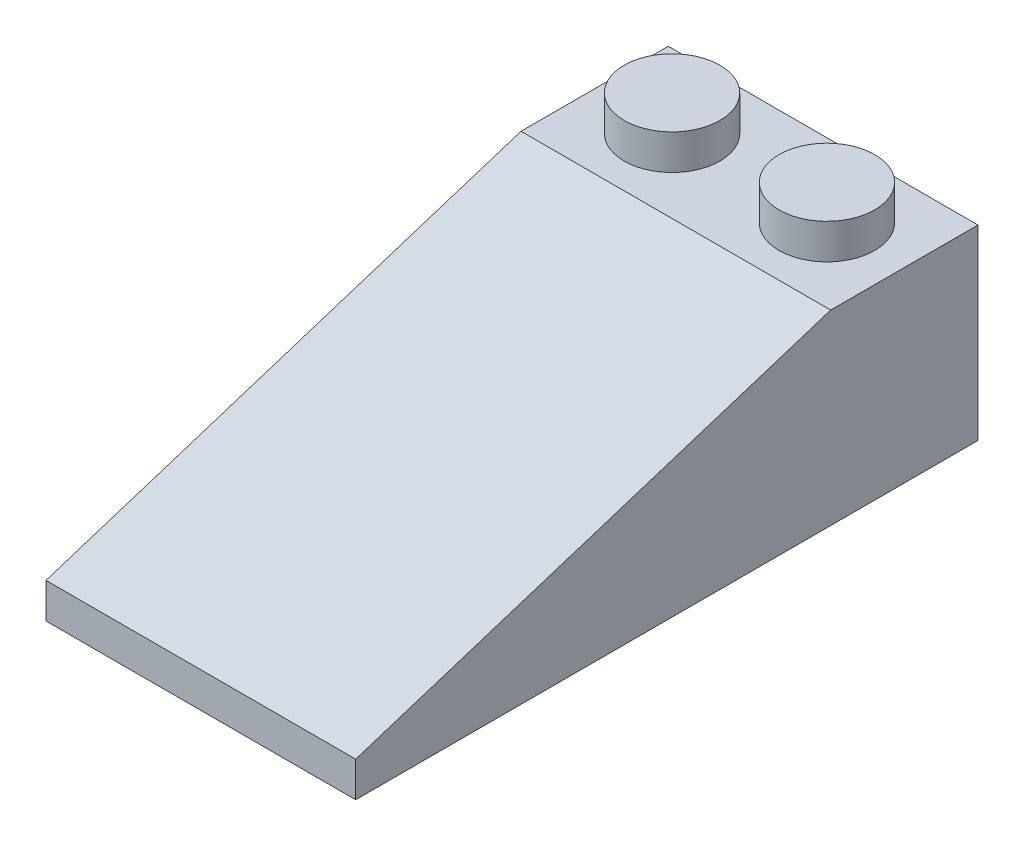
ISO-10303-21;
HEADER;
FILE_DESCRIPTION(('STEP AP214'),'2;1');
FILE_NAME('part.step','',(''),(''),'','','');
FILE_SCHEMA(('AUTOMOTIVE_DESIGN { 1 0 10303 214 1 1 1 1 }'));
ENDSEC;
DATA;
#1=APPLICATION_CONTEXT('core data for automotive mechanical design processes');
#2=APPLICATION_PROTOCOL_DEFINITION('international standard','automotive_design',2000,#1);
#3=PRODUCT_CONTEXT('',#1,'mechanical');
#4=PRODUCT('Part','Part','',(#3));
#5=PRODUCT_RELATED_PRODUCT_CATEGORY('part','',(#4));
#6=PRODUCT_DEFINITION_FORMATION('','',#4);
#7=PRODUCT_DEFINITION_CONTEXT('part definition',#1,'design');
#8=PRODUCT_DEFINITION('design','',#6,#7);
#9=PRODUCT_DEFINITION_SHAPE('','',#8);
#10=(LENGTH_UNIT() NAMED_UNIT(*) SI_UNIT(.MILLI.,.METRE.));
#11=(NAMED_UNIT(*) PLANE_ANGLE_UNIT() SI_UNIT($,.RADIAN.));
#12=(NAMED_UNIT(*) SI_UNIT($,.STERADIAN.) SOLID_ANGLE_UNIT());
#13=UNCERTAINTY_MEASURE_WITH_UNIT(LENGTH_MEASURE(1.E-05),#10,'distance_accuracy_value','');
#14=(GEOMETRIC_REPRESENTATION_CONTEXT(3) GLOBAL_UNCERTAINTY_ASSIGNED_CONTEXT((#13)) GLOBAL_UNIT_ASSIGNED_CONTEXT((#10,
#11,#12)) REPRESENTATION_CONTEXT('',''));
#15=CARTESIAN_POINT('',(0.,0.,0.));
#16=DIRECTION('',(0.,0.,1.));
#17=DIRECTION('',(1.,0.,0.));
#18=AXIS2_PLACEMENT_3D('',#15,#16,#17);
#19=CARTESIAN_POINT('',(-15.85,8.05,7.54));
#20=DIRECTION('',(0.,1.,0.));
#21=DIRECTION('',(0.,0.,1.));
#22=AXIS2_PLACEMENT_3D('',#19,#20,#21);
#23=PLANE('',#22);
#24=CARTESIAN_POINT('',(-3.9625,8.05,3.77));
#25=DIRECTION('',(0.,1.,0.));
#26=DIRECTION('',(0.,0.,1.));
#27=AXIS2_PLACEMENT_3D('',#24,#25,#26);
#28=CIRCLE('',#27,0.950000000000001);
#29=CARTESIAN_POINT('',(-3.9625,8.05,4.72));
#30=VERTEX_POINT('',#29);
#31=EDGE_CURVE('E161',#30,#30,#28,.T.);
#32=ORIENTED_EDGE('',*,*,#31,.T.);
#33=EDGE_LOOP('',(#32));
#34=FACE_BOUND('',#33,.T.);
#35=CARTESIAN_POINT('',(-11.8875,8.05,3.77));
#36=DIRECTION('',(0.,1.,0.));
#37=DIRECTION('',(0.,0.,1.));
#38=AXIS2_PLACEMENT_3D('',#35,#36,#37);
#39=CIRCLE('',#38,0.950000000000001);
#40=CARTESIAN_POINT('',(-11.8875,8.05,4.72));
#41=VERTEX_POINT('',#40);
#42=EDGE_CURVE('E157',#41,#41,#39,.T.);
#43=ORIENTED_EDGE('',*,*,#42,.T.);
#44=EDGE_LOOP('',(#43));
#45=FACE_BOUND('',#44,.T.);
#46=CARTESIAN_POINT('',(-7.92500000000005,8.05,7.9625));
#47=DIRECTION('',(0.,1.,0.));
#48=DIRECTION('',(0.,0.,1.));
#49=AXIS2_PLACEMENT_3D('',#46,#47,#48);
#50=CIRCLE('',#49,3.25);
#51=CARTESIAN_POINT('',(-11.1081442615568,8.05,7.30668553681826));
#52=VERTEX_POINT('',#51);
#53=CARTESIAN_POINT('',(-4.74185573844331,8.05,7.30668553681826));
#54=VERTEX_POINT('',#53);
#55=EDGE_CURVE('E11',#52,#54,#50,.F.);
#56=ORIENTED_EDGE('',*,*,#55,.F.);
#57=DIRECTION('',(1.,0.,0.));
#58=VECTOR('',#57,1.);
#59=CARTESIAN_POINT('',(-15.85,8.05,7.30668553681826));
#60=LINE('',#59,#58);
#61=CARTESIAN_POINT('',(-14.35,8.05,7.30668553681826));
#62=VERTEX_POINT('',#61);
#63=EDGE_CURVE('E128',#62,#52,#60,.T.);
#64=ORIENTED_EDGE('',*,*,#63,.F.);
#65=DIRECTION('',(0.,0.,1.));
#66=VECTOR('',#65,1.);
#67=CARTESIAN_POINT('',(-14.35,8.05,7.54));
#68=LINE('',#67,#66);
#69=CARTESIAN_POINT('',(-14.35,8.05,1.5));
#70=VERTEX_POINT('',#69);
#71=EDGE_CURVE('E135',#70,#62,#68,.T.);
#72=ORIENTED_EDGE('',*,*,#71,.F.);
#73=DIRECTION('',(1.,0.,0.));
#74=VECTOR('',#73,1.);
#75=CARTESIAN_POINT('',(-15.85,8.05,1.5));
#76=LINE('',#75,#74);
#77=CARTESIAN_POINT('',(-1.5,8.05,1.5));
#78=VERTEX_POINT('',#77);
#79=EDGE_CURVE('E132',#70,#78,#76,.T.);
#80=ORIENTED_EDGE('',*,*,#79,.T.);
#81=DIRECTION('',(0.,0.,1.));
#82=VECTOR('',#81,1.);
#83=CARTESIAN_POINT('',(-1.5,8.05,7.54));
#84=LINE('',#83,#82);
#85=CARTESIAN_POINT('',(-1.5,8.05,7.30668553681826));
#86=VERTEX_POINT('',#85);
#87=EDGE_CURVE('E141',#78,#86,#84,.T.);
#88=ORIENTED_EDGE('',*,*,#87,.T.);
#89=EDGE_CURVE('E129',#54,#86,#60,.T.);
#90=ORIENTED_EDGE('',*,*,#89,.F.);
#91=EDGE_LOOP('',(#56,#64,#72,#80,#88,#90));
#92=FACE_BOUND('',#91,.T.);
#93=ADVANCED_FACE('F33',(#34,#45,#92),#23,.F.);
#94=CARTESIAN_POINT('',(-15.85,0.,0.));
#95=DIRECTION('',(0.,-1.,0.));
#96=DIRECTION('',(0.,0.,-1.));
#97=AXIS2_PLACEMENT_3D('',#94,#95,#96);
#98=PLANE('',#97);
#99=DIRECTION('',(0.,0.,-1.));
#100=VECTOR('',#99,1.);
#101=CARTESIAN_POINT('',(0.,0.,0.));
#102=LINE('',#101,#100);
#103=CARTESIAN_POINT('',(0.,0.,31.85));
#104=VERTEX_POINT('',#103);
#105=CARTESIAN_POINT('',(0.,0.,0.));
#106=VERTEX_POINT('',#105);
#107=EDGE_CURVE('E187',#104,#106,#102,.T.);
#108=ORIENTED_EDGE('',*,*,#107,.F.);
#109=DIRECTION('',(1.,0.,0.));
#110=VECTOR('',#109,1.);
#111=CARTESIAN_POINT('',(-15.85,0.,31.85));
#112=LINE('',#111,#110);
#113=CARTESIAN_POINT('',(-15.85,0.,31.85));
#114=VERTEX_POINT('',#113);
#115=EDGE_CURVE('E216',#114,#104,#112,.T.);
#116=ORIENTED_EDGE('',*,*,#115,.F.);
#117=DIRECTION('',(0.,0.,-1.));
#118=VECTOR('',#117,1.);
#119=CARTESIAN_POINT('',(-15.85,0.,0.));
#120=LINE('',#119,#118);
#121=CARTESIAN_POINT('',(-15.85,0.,0.));
#122=VERTEX_POINT('',#121);
#123=EDGE_CURVE('E196',#114,#122,#120,.T.);
#124=ORIENTED_EDGE('',*,*,#123,.T.);
#125=DIRECTION('',(1.,0.,0.));
#126=VECTOR('',#125,1.);
#127=CARTESIAN_POINT('',(-15.85,0.,0.));
#128=LINE('',#127,#126);
#129=EDGE_CURVE('E213',#122,#106,#128,.T.);
#130=ORIENTED_EDGE('',*,*,#129,.T.);
#131=EDGE_LOOP('',(#108,#116,#124,#130));
#132=FACE_BOUND('',#131,.T.);
#133=DIRECTION('',(1.,0.,0.));
#134=VECTOR('',#133,1.);
#135=CARTESIAN_POINT('',(-15.85,0.,30.35));
#136=LINE('',#135,#134);
#137=CARTESIAN_POINT('',(-14.35,0.,30.35));
#138=VERTEX_POINT('',#137);
#139=CARTESIAN_POINT('',(-1.5,0.,30.35));
#140=VERTEX_POINT('',#139);
#141=EDGE_CURVE('E147',#138,#140,#136,.T.);
#142=ORIENTED_EDGE('',*,*,#141,.T.);
#143=DIRECTION('',(0.,0.,-1.));
#144=VECTOR('',#143,1.);
#145=CARTESIAN_POINT('',(-1.5,0.,0.));
#146=LINE('',#145,#144);
#147=CARTESIAN_POINT('',(-1.5,0.,1.5));
#148=VERTEX_POINT('',#147);
#149=EDGE_CURVE('E149',#140,#148,#146,.T.);
#150=ORIENTED_EDGE('',*,*,#149,.T.);
#151=DIRECTION('',(1.,0.,0.));
#152=VECTOR('',#151,1.);
#153=CARTESIAN_POINT('',(-15.85,0.,1.5));
#154=LINE('',#153,#152);
#155=CARTESIAN_POINT('',(-14.35,0.,1.5));
#156=VERTEX_POINT('',#155);
#157=EDGE_CURVE('E162',#156,#148,#154,.T.);
#158=ORIENTED_EDGE('',*,*,#157,.F.);
#159=DIRECTION('',(0.,0.,-1.));
#160=VECTOR('',#159,1.);
#161=CARTESIAN_POINT('',(-14.35,0.,0.));
#162=LINE('',#161,#160);
#163=EDGE_CURVE('E152',#138,#156,#162,.T.);
#164=ORIENTED_EDGE('',*,*,#163,.F.);
#165=EDGE_LOOP('',(#142,#150,#158,#164));
#166=FACE_BOUND('',#165,.T.);
#167=ADVANCED_FACE('F259',(#132,#166),#98,.T.);
#168=CARTESIAN_POINT('',(-15.85,9.55,0.));
#169=DIRECTION('',(0.,0.,-1.));
#170=DIRECTION('',(-1.,0.,0.));
#171=AXIS2_PLACEMENT_3D('',#168,#169,#170);
#172=PLANE('',#171);
#173=DIRECTION('',(0.,1.,0.));
#174=VECTOR('',#173,1.);
#175=CARTESIAN_POINT('',(0.,9.55,0.));
#176=LINE('',#175,#174);
#177=CARTESIAN_POINT('',(0.,9.55,0.));
#178=VERTEX_POINT('',#177);
#179=EDGE_CURVE('E180',#106,#178,#176,.T.);
#180=ORIENTED_EDGE('',*,*,#179,.F.);
#181=ORIENTED_EDGE('',*,*,#129,.F.);
#182=DIRECTION('',(0.,1.,0.));
#183=VECTOR('',#182,1.);
#184=CARTESIAN_POINT('',(-15.85,9.55,0.));
#185=LINE('',#184,#183);
#186=CARTESIAN_POINT('',(-15.85,9.55,0.));
#187=VERTEX_POINT('',#186);
#188=EDGE_CURVE('E183',#122,#187,#185,.T.);
#189=ORIENTED_EDGE('',*,*,#188,.T.);
#190=DIRECTION('',(1.,0.,0.));
#191=VECTOR('',#190,1.);
#192=CARTESIAN_POINT('',(-15.85,9.55,0.));
#193=LINE('',#192,#191);
#194=EDGE_CURVE('E199',#187,#178,#193,.T.);
#195=ORIENTED_EDGE('',*,*,#194,.T.);
#196=EDGE_LOOP('',(#180,#181,#189,#195));
#197=FACE_BOUND('',#196,.T.);
#198=ADVANCED_FACE('F35',(#197),#172,.T.);
#199=CARTESIAN_POINT('',(-15.85,0.,31.85));
#200=DIRECTION('',(0.,0.,1.));
#201=DIRECTION('',(1.,0.,0.));
#202=AXIS2_PLACEMENT_3D('',#199,#200,#201);
#203=PLANE('',#202);
#204=DIRECTION('',(0.,-1.,0.));
#205=VECTOR('',#204,1.);
#206=CARTESIAN_POINT('',(0.,0.,31.85));
#207=LINE('',#206,#205);
#208=CARTESIAN_POINT('',(0.,1.8,31.85));
#209=VERTEX_POINT('',#208);
#210=EDGE_CURVE('E208',#209,#104,#207,.T.);
#211=ORIENTED_EDGE('',*,*,#210,.F.);
#212=DIRECTION('',(1.,0.,0.));
#213=VECTOR('',#212,1.);
#214=CARTESIAN_POINT('',(-15.85,1.8,31.85));
#215=LINE('',#214,#213);
#216=CARTESIAN_POINT('',(-15.85,1.8,31.85));
#217=VERTEX_POINT('',#216);
#218=EDGE_CURVE('E218',#217,#209,#215,.T.);
#219=ORIENTED_EDGE('',*,*,#218,.F.);
#220=DIRECTION('',(0.,-1.,0.));
#221=VECTOR('',#220,1.);
#222=CARTESIAN_POINT('',(-15.85,0.,31.85));
#223=LINE('',#222,#221);
#224=EDGE_CURVE('E193',#217,#114,#223,.T.);
#225=ORIENTED_EDGE('',*,*,#224,.T.);
#226=ORIENTED_EDGE('',*,*,#115,.T.);
#227=EDGE_LOOP('',(#211,#219,#225,#226));
#228=FACE_BOUND('',#227,.T.);
#229=ADVANCED_FACE('F406',(#228),#203,.T.);
#230=CARTESIAN_POINT('',(-15.85,1.8,31.85));
#231=DIRECTION('',(0.,0.952755774285987,0.303737443468383));
#232=DIRECTION('',(0.,-0.303737443468384,0.952755774285987));
#233=AXIS2_PLACEMENT_3D('',#230,#231,#232);
#234=PLANE('',#233);
#235=DIRECTION('',(0.,-0.303737443468383,0.952755774285987));
#236=VECTOR('',#235,1.);
#237=CARTESIAN_POINT('',(0.,1.8,31.85));
#238=LINE('',#237,#236);
#239=CARTESIAN_POINT('',(0.,9.55,7.54));
#240=VERTEX_POINT('',#239);
#241=EDGE_CURVE('E205',#240,#209,#238,.T.);
#242=ORIENTED_EDGE('',*,*,#241,.F.);
#243=DIRECTION('',(1.,0.,0.));
#244=VECTOR('',#243,1.);
#245=CARTESIAN_POINT('',(-15.85,9.55,7.54));
#246=LINE('',#245,#244);
#247=CARTESIAN_POINT('',(-15.85,9.55,7.54));
#248=VERTEX_POINT('',#247);
#249=EDGE_CURVE('E220',#248,#240,#246,.T.);
#250=ORIENTED_EDGE('',*,*,#249,.F.);
#251=DIRECTION('',(0.,-0.303737443468383,0.952755774285987));
#252=VECTOR('',#251,1.);
#253=CARTESIAN_POINT('',(-15.85,1.8,31.85));
#254=LINE('',#253,#252);
#255=EDGE_CURVE('E190',#248,#217,#254,.T.);
#256=ORIENTED_EDGE('',*,*,#255,.T.);
#257=ORIENTED_EDGE('',*,*,#218,.T.);
#258=EDGE_LOOP('',(#242,#250,#256,#257));
#259=FACE_BOUND('',#258,.T.);
#260=ADVANCED_FACE('F409',(#259),#234,.T.);
#261=CARTESIAN_POINT('',(-15.85,9.55,7.54));
#262=DIRECTION('',(0.,1.,0.));
#263=DIRECTION('',(0.,0.,1.));
#264=AXIS2_PLACEMENT_3D('',#261,#262,#263);
#265=PLANE('',#264);
#266=CARTESIAN_POINT('',(-3.9625,9.55,3.77));
#267=DIRECTION('',(0.,1.,0.));
#268=DIRECTION('',(0.,0.,1.));
#269=AXIS2_PLACEMENT_3D('',#266,#267,#268);
#270=CIRCLE('',#269,2.45);
#271=CARTESIAN_POINT('',(-3.9625,9.55,6.22));
#272=VERTEX_POINT('',#271);
#273=EDGE_CURVE('E164',#272,#272,#270,.T.);
#274=ORIENTED_EDGE('',*,*,#273,.F.);
#275=EDGE_LOOP('',(#274));
#276=FACE_BOUND('',#275,.T.);
#277=CARTESIAN_POINT('',(-11.8875,9.55,3.77));
#278=DIRECTION('',(0.,1.,0.));
#279=DIRECTION('',(0.,0.,1.));
#280=AXIS2_PLACEMENT_3D('',#277,#278,#279);
#281=CIRCLE('',#280,2.45);
#282=CARTESIAN_POINT('',(-11.8875,9.55,6.22));
#283=VERTEX_POINT('',#282);
#284=EDGE_CURVE('E174',#283,#283,#281,.T.);
#285=ORIENTED_EDGE('',*,*,#284,.F.);
#286=EDGE_LOOP('',(#285));
#287=FACE_BOUND('',#286,.T.);
#288=DIRECTION('',(0.,0.,1.));
#289=VECTOR('',#288,1.);
#290=CARTESIAN_POINT('',(0.,9.55,7.54));
#291=LINE('',#290,#289);
#292=EDGE_CURVE('E202',#178,#240,#291,.T.);
#293=ORIENTED_EDGE('',*,*,#292,.F.);
#294=ORIENTED_EDGE('',*,*,#194,.F.);
#295=DIRECTION('',(0.,0.,1.));
#296=VECTOR('',#295,1.);
#297=CARTESIAN_POINT('',(-15.85,9.55,7.54));
#298=LINE('',#297,#296);
#299=EDGE_CURVE('E186',#187,#248,#298,.T.);
#300=ORIENTED_EDGE('',*,*,#299,.T.);
#301=ORIENTED_EDGE('',*,*,#249,.T.);
#302=EDGE_LOOP('',(#293,#294,#300,#301));
#303=FACE_BOUND('',#302,.T.);
#304=ADVANCED_FACE('F401',(#276,#287,#303),#265,.T.);
#305=CARTESIAN_POINT('',(-15.85,0.,0.));
#306=DIRECTION('',(-1.,0.,0.));
#307=DIRECTION('',(0.,0.,1.));
#308=AXIS2_PLACEMENT_3D('',#305,#306,#307);
#309=PLANE('',#308);
#310=ORIENTED_EDGE('',*,*,#188,.F.);
#311=ORIENTED_EDGE('',*,*,#123,.F.);
#312=ORIENTED_EDGE('',*,*,#224,.F.);
#313=ORIENTED_EDGE('',*,*,#255,.F.);
#314=ORIENTED_EDGE('',*,*,#299,.F.);
#315=EDGE_LOOP('',(#310,#311,#312,#313,#314));
#316=FACE_BOUND('',#315,.T.);
#317=ADVANCED_FACE('F398',(#316),#309,.T.);
#318=CARTESIAN_POINT('',(0.,0.,0.));
#319=DIRECTION('',(-1.,0.,0.));
#320=DIRECTION('',(0.,0.,1.));
#321=AXIS2_PLACEMENT_3D('',#318,#319,#320);
#322=PLANE('',#321);
#323=ORIENTED_EDGE('',*,*,#179,.T.);
#324=ORIENTED_EDGE('',*,*,#292,.T.);
#325=ORIENTED_EDGE('',*,*,#241,.T.);
#326=ORIENTED_EDGE('',*,*,#210,.T.);
#327=ORIENTED_EDGE('',*,*,#107,.T.);
#328=EDGE_LOOP('',(#323,#324,#325,#326,#327));
#329=FACE_BOUND('',#328,.T.);
#330=ADVANCED_FACE('F396',(#329),#322,.F.);
#331=CARTESIAN_POINT('',(-11.8875,11.35,3.77));
#332=DIRECTION('',(0.,-1.,0.));
#333=DIRECTION('',(0.,0.,-1.));
#334=AXIS2_PLACEMENT_3D('',#331,#332,#333);
#335=CYLINDRICAL_SURFACE('',#334,2.45);
#336=CARTESIAN_POINT('',(-11.8875,11.35,3.77));
#337=DIRECTION('',(0.,1.,0.));
#338=DIRECTION('',(0.,0.,1.));
#339=AXIS2_PLACEMENT_3D('',#336,#337,#338);
#340=CIRCLE('',#339,2.45);
#341=CARTESIAN_POINT('',(-11.8875,11.35,6.22));
#342=VERTEX_POINT('',#341);
#343=EDGE_CURVE('E177',#342,#342,#340,.T.);
#344=ORIENTED_EDGE('',*,*,#343,.F.);
#345=EDGE_LOOP('',(#344));
#346=FACE_BOUND('',#345,.T.);
#347=ORIENTED_EDGE('',*,*,#284,.T.);
#348=EDGE_LOOP('',(#347));
#349=FACE_BOUND('',#348,.T.);
#350=ADVANCED_FACE('F392',(#346,#349),#335,.T.);
#351=CARTESIAN_POINT('',(-11.8875,11.35,3.77));
#352=DIRECTION('',(0.,1.,0.));
#353=DIRECTION('',(0.,0.,1.));
#354=AXIS2_PLACEMENT_3D('',#351,#352,#353);
#355=PLANE('',#354);
#356=ORIENTED_EDGE('',*,*,#343,.T.);
#357=EDGE_LOOP('',(#356));
#358=FACE_BOUND('',#357,.T.);
#359=ADVANCED_FACE('F385',(#358),#355,.T.);
#360=CARTESIAN_POINT('',(-3.9625,11.35,3.77));
#361=DIRECTION('',(0.,-1.,0.));
#362=DIRECTION('',(0.,0.,-1.));
#363=AXIS2_PLACEMENT_3D('',#360,#361,#362);
#364=CYLINDRICAL_SURFACE('',#363,2.45);
#365=CARTESIAN_POINT('',(-3.9625,11.35,3.77));
#366=DIRECTION('',(0.,1.,0.));
#367=DIRECTION('',(0.,0.,1.));
#368=AXIS2_PLACEMENT_3D('',#365,#366,#367);
#369=CIRCLE('',#368,2.45);
#370=CARTESIAN_POINT('',(-3.9625,11.35,6.22));
#371=VERTEX_POINT('',#370);
#372=EDGE_CURVE('E171',#371,#371,#369,.T.);
#373=ORIENTED_EDGE('',*,*,#372,.F.);
#374=EDGE_LOOP('',(#373));
#375=FACE_BOUND('',#374,.T.);
#376=ORIENTED_EDGE('',*,*,#273,.T.);
#377=EDGE_LOOP('',(#376));
#378=FACE_BOUND('',#377,.T.);
#379=ADVANCED_FACE('F379',(#375,#378),#364,.T.);
#380=CARTESIAN_POINT('',(-3.9625,11.35,3.77));
#381=DIRECTION('',(0.,1.,0.));
#382=DIRECTION('',(0.,0.,1.));
#383=AXIS2_PLACEMENT_3D('',#380,#381,#382);
#384=PLANE('',#383);
#385=ORIENTED_EDGE('',*,*,#372,.T.);
#386=EDGE_LOOP('',(#385));
#387=FACE_BOUND('',#386,.T.);
#388=ADVANCED_FACE('F375',(#387),#384,.T.);
#389=CARTESIAN_POINT('',(-15.85,9.55,1.5));
#390=DIRECTION('',(0.,0.,-1.));
#391=DIRECTION('',(-1.,0.,0.));
#392=AXIS2_PLACEMENT_3D('',#389,#390,#391);
#393=PLANE('',#392);
#394=DIRECTION('',(0.,1.,0.));
#395=VECTOR('',#394,1.);
#396=CARTESIAN_POINT('',(-1.5,9.55,1.5));
#397=LINE('',#396,#395);
#398=EDGE_CURVE('E156',#148,#78,#397,.T.);
#399=ORIENTED_EDGE('',*,*,#398,.T.);
#400=ORIENTED_EDGE('',*,*,#79,.F.);
#401=DIRECTION('',(0.,1.,0.));
#402=VECTOR('',#401,1.);
#403=CARTESIAN_POINT('',(-14.35,9.55,1.5));
#404=LINE('',#403,#402);
#405=EDGE_CURVE('E167',#156,#70,#404,.T.);
#406=ORIENTED_EDGE('',*,*,#405,.F.);
#407=ORIENTED_EDGE('',*,*,#157,.T.);
#408=EDGE_LOOP('',(#399,#400,#406,#407));
#409=FACE_BOUND('',#408,.T.);
#410=ADVANCED_FACE('F342',(#409),#393,.F.);
#411=CARTESIAN_POINT('',(-15.85,0.,30.35));
#412=DIRECTION('',(0.,0.,1.));
#413=DIRECTION('',(1.,0.,0.));
#414=AXIS2_PLACEMENT_3D('',#411,#412,#413);
#415=PLANE('',#414);
#416=DIRECTION('',(0.,-1.,0.));
#417=VECTOR('',#416,1.);
#418=CARTESIAN_POINT('',(-1.5,0.,30.35));
#419=LINE('',#418,#417);
#420=CARTESIAN_POINT('',(-1.5,0.703817890182699,30.35));
#421=VERTEX_POINT('',#420);
#422=EDGE_CURVE('E140',#421,#140,#419,.T.);
#423=ORIENTED_EDGE('',*,*,#422,.T.);
#424=ORIENTED_EDGE('',*,*,#141,.F.);
#425=DIRECTION('',(0.,-1.,0.));
#426=VECTOR('',#425,1.);
#427=CARTESIAN_POINT('',(-14.35,0.,30.35));
#428=LINE('',#427,#426);
#429=CARTESIAN_POINT('',(-14.35,0.703817890182699,30.35));
#430=VERTEX_POINT('',#429);
#431=EDGE_CURVE('E145',#430,#138,#428,.T.);
#432=ORIENTED_EDGE('',*,*,#431,.F.);
#433=DIRECTION('',(1.,0.,0.));
#434=VECTOR('',#433,1.);
#435=CARTESIAN_POINT('',(-15.85,0.703817890182699,30.35));
#436=LINE('',#435,#434);
#437=EDGE_CURVE('E131',#430,#421,#436,.T.);
#438=ORIENTED_EDGE('',*,*,#437,.T.);
#439=EDGE_LOOP('',(#423,#424,#432,#438));
#440=FACE_BOUND('',#439,.T.);
#441=ADVANCED_FACE('F234',(#440),#415,.F.);
#442=CARTESIAN_POINT('',(-15.85,0.370866338571016,31.3943938347974));
#443=DIRECTION('',(0.,0.952755774285987,0.303737443468383));
#444=DIRECTION('',(0.,-0.303737443468384,0.952755774285987));
#445=AXIS2_PLACEMENT_3D('',#442,#443,#444);
#446=PLANE('',#445);
#447=CARTESIAN_POINT('',(-7.92500000000005,7.8409271044978,7.9625));
#448=DIRECTION('',(0.,0.952755774285987,0.303737443468383));
#449=DIRECTION('',(0.,-0.303737443468384,0.952755774285987));
#450=AXIS2_PLACEMENT_3D('',#447,#448,#449);
#451=ELLIPSE('',#450,3.41115749462197,3.25);
#452=EDGE_CURVE('E351',#52,#54,#451,.T.);
#453=ORIENTED_EDGE('',*,*,#452,.T.);
#454=ORIENTED_EDGE('',*,*,#89,.T.);
#455=DIRECTION('',(0.,-0.303737443468384,0.952755774285987));
#456=VECTOR('',#455,1.);
#457=CARTESIAN_POINT('',(-1.5,0.370866338571016,31.3943938347974));
#458=LINE('',#457,#456);
#459=EDGE_CURVE('E137',#86,#421,#458,.T.);
#460=ORIENTED_EDGE('',*,*,#459,.T.);
#461=ORIENTED_EDGE('',*,*,#437,.F.);
#462=DIRECTION('',(0.,-0.303737443468384,0.952755774285987));
#463=VECTOR('',#462,1.);
#464=CARTESIAN_POINT('',(-14.35,0.370866338571016,31.3943938347974));
#465=LINE('',#464,#463);
#466=EDGE_CURVE('E142',#62,#430,#465,.T.);
#467=ORIENTED_EDGE('',*,*,#466,.F.);
#468=ORIENTED_EDGE('',*,*,#63,.T.);
#469=EDGE_LOOP('',(#453,#454,#460,#461,#467,#468));
#470=FACE_BOUND('',#469,.T.);
#471=CARTESIAN_POINT('',(-7.92500000000003,5.30249127562079,15.925));
#472=DIRECTION('',(0.,0.952755774285987,0.303737443468383));
#473=DIRECTION('',(0.,-0.303737443468384,0.952755774285987));
#474=AXIS2_PLACEMENT_3D('',#471,#472,#473);
#475=ELLIPSE('',#474,3.41115749462197,3.25);
#476=CARTESIAN_POINT('',(-7.92500000000003,4.2663950189363,19.175));
#477=VERTEX_POINT('',#476);
#478=EDGE_CURVE('E121',#477,#477,#475,.F.);
#479=ORIENTED_EDGE('',*,*,#478,.F.);
#480=EDGE_LOOP('',(#479));
#481=FACE_BOUND('',#480,.T.);
#482=CARTESIAN_POINT('',(-7.925,2.76405544674378,23.8875));
#483=DIRECTION('',(0.,0.952755774285987,0.303737443468383));
#484=DIRECTION('',(0.,-0.303737443468384,0.952755774285987));
#485=AXIS2_PLACEMENT_3D('',#482,#483,#484);
#486=ELLIPSE('',#485,3.41115749462197,3.25);
#487=CARTESIAN_POINT('',(-7.925,1.72795919005929,27.1375));
#488=VERTEX_POINT('',#487);
#489=EDGE_CURVE('E215',#488,#488,#486,.F.);
#490=ORIENTED_EDGE('',*,*,#489,.F.);
#491=EDGE_LOOP('',(#490));
#492=FACE_BOUND('',#491,.T.);
#493=ADVANCED_FACE('F230',(#470,#481,#492),#446,.F.);
#494=CARTESIAN_POINT('',(-14.35,0.,0.));
#495=DIRECTION('',(-1.,0.,0.));
#496=DIRECTION('',(0.,0.,1.));
#497=AXIS2_PLACEMENT_3D('',#494,#495,#496);
#498=PLANE('',#497);
#499=ORIENTED_EDGE('',*,*,#405,.T.);
#500=ORIENTED_EDGE('',*,*,#71,.T.);
#501=ORIENTED_EDGE('',*,*,#466,.T.);
#502=ORIENTED_EDGE('',*,*,#431,.T.);
#503=ORIENTED_EDGE('',*,*,#163,.T.);
#504=EDGE_LOOP('',(#499,#500,#501,#502,#503));
#505=FACE_BOUND('',#504,.T.);
#506=ADVANCED_FACE('F233',(#505),#498,.F.);
#507=CARTESIAN_POINT('',(-1.5,0.,0.));
#508=DIRECTION('',(-1.,0.,0.));
#509=DIRECTION('',(0.,0.,1.));
#510=AXIS2_PLACEMENT_3D('',#507,#508,#509);
#511=PLANE('',#510);
#512=ORIENTED_EDGE('',*,*,#398,.F.);
#513=ORIENTED_EDGE('',*,*,#149,.F.);
#514=ORIENTED_EDGE('',*,*,#422,.F.);
#515=ORIENTED_EDGE('',*,*,#459,.F.);
#516=ORIENTED_EDGE('',*,*,#87,.F.);
#517=EDGE_LOOP('',(#512,#513,#514,#515,#516));
#518=FACE_BOUND('',#517,.T.);
#519=ADVANCED_FACE('F338',(#518),#511,.T.);
#520=CARTESIAN_POINT('',(-11.8875,11.35,3.77));
#521=DIRECTION('',(0.,-1.,0.));
#522=DIRECTION('',(0.,0.,-1.));
#523=AXIS2_PLACEMENT_3D('',#520,#521,#522);
#524=CYLINDRICAL_SURFACE('',#523,0.950000000000001);
#525=CARTESIAN_POINT('',(-11.8875,9.85,3.77));
#526=DIRECTION('',(0.,1.,0.));
#527=DIRECTION('',(0.,0.,1.));
#528=AXIS2_PLACEMENT_3D('',#525,#526,#527);
#529=CIRCLE('',#528,0.950000000000001);
#530=CARTESIAN_POINT('',(-11.8875,9.85,4.72));
#531=VERTEX_POINT('',#530);
#532=EDGE_CURVE('E153',#531,#531,#529,.T.);
#533=ORIENTED_EDGE('',*,*,#532,.T.);
#534=EDGE_LOOP('',(#533));
#535=FACE_BOUND('',#534,.T.);
#536=ORIENTED_EDGE('',*,*,#42,.F.);
#537=EDGE_LOOP('',(#536));
#538=FACE_BOUND('',#537,.T.);
#539=ADVANCED_FACE('F516',(#535,#538),#524,.F.);
#540=CARTESIAN_POINT('',(-11.8875,9.85,3.77));
#541=DIRECTION('',(0.,1.,0.));
#542=DIRECTION('',(0.,0.,1.));
#543=AXIS2_PLACEMENT_3D('',#540,#541,#542);
#544=PLANE('',#543);
#545=ORIENTED_EDGE('',*,*,#532,.F.);
#546=EDGE_LOOP('',(#545));
#547=FACE_BOUND('',#546,.T.);
#548=ADVANCED_FACE('F525',(#547),#544,.F.);
#549=CARTESIAN_POINT('',(-3.9625,11.35,3.77));
#550=DIRECTION('',(0.,-1.,0.));
#551=DIRECTION('',(0.,0.,-1.));
#552=AXIS2_PLACEMENT_3D('',#549,#550,#551);
#553=CYLINDRICAL_SURFACE('',#552,0.950000000000001);
#554=CARTESIAN_POINT('',(-3.9625,9.85,3.77));
#555=DIRECTION('',(0.,1.,0.));
#556=DIRECTION('',(0.,0.,1.));
#557=AXIS2_PLACEMENT_3D('',#554,#555,#556);
#558=CIRCLE('',#557,0.950000000000001);
#559=CARTESIAN_POINT('',(-3.9625,9.85,4.72));
#560=VERTEX_POINT('',#559);
#561=EDGE_CURVE('E158',#560,#560,#558,.T.);
#562=ORIENTED_EDGE('',*,*,#561,.T.);
#563=EDGE_LOOP('',(#562));
#564=FACE_BOUND('',#563,.T.);
#565=ORIENTED_EDGE('',*,*,#31,.F.);
#566=EDGE_LOOP('',(#565));
#567=FACE_BOUND('',#566,.T.);
#568=ADVANCED_FACE('F253',(#564,#567),#553,.F.);
#569=CARTESIAN_POINT('',(-3.9625,9.85,3.77));
#570=DIRECTION('',(0.,1.,0.));
#571=DIRECTION('',(0.,0.,1.));
#572=AXIS2_PLACEMENT_3D('',#569,#570,#571);
#573=PLANE('',#572);
#574=ORIENTED_EDGE('',*,*,#561,.F.);
#575=EDGE_LOOP('',(#574));
#576=FACE_BOUND('',#575,.T.);
#577=ADVANCED_FACE('F243',(#576),#573,.F.);
#578=CARTESIAN_POINT('',(-7.925,17.2612263744954,23.8875));
#579=DIRECTION('',(0.,-1.,0.));
#580=DIRECTION('',(0.,0.,-1.));
#581=AXIS2_PLACEMENT_3D('',#578,#579,#580);
#582=CYLINDRICAL_SURFACE('',#581,3.25);
#583=CARTESIAN_POINT('',(-7.925,0.,23.8875));
#584=DIRECTION('',(0.,1.,0.));
#585=DIRECTION('',(0.,0.,1.));
#586=AXIS2_PLACEMENT_3D('',#583,#584,#585);
#587=CIRCLE('',#586,3.25);
#588=CARTESIAN_POINT('',(-7.925,0.,27.1375));
#589=VERTEX_POINT('',#588);
#590=EDGE_CURVE('E317',#589,#589,#587,.T.);
#591=ORIENTED_EDGE('',*,*,#590,.T.);
#592=EDGE_LOOP('',(#591));
#593=FACE_BOUND('',#592,.T.);
#594=ORIENTED_EDGE('',*,*,#489,.T.);
#595=EDGE_LOOP('',(#594));
#596=FACE_BOUND('',#595,.T.);
#597=ADVANCED_FACE('F240',(#593,#596),#582,.T.);
#598=CARTESIAN_POINT('',(-7.925,0.,23.8875));
#599=DIRECTION('',(0.,1.,0.));
#600=DIRECTION('',(0.,0.,1.));
#601=AXIS2_PLACEMENT_3D('',#598,#599,#600);
#602=PLANE('',#601);
#603=ORIENTED_EDGE('',*,*,#590,.F.);
#604=EDGE_LOOP('',(#603));
#605=FACE_BOUND('',#604,.T.);
#606=CARTESIAN_POINT('',(-7.925,0.,23.8875));
#607=DIRECTION('',(0.,1.,0.));
#608=DIRECTION('',(0.,0.,1.));
#609=AXIS2_PLACEMENT_3D('',#606,#607,#608);
#610=CIRCLE('',#609,2.45);
#611=CARTESIAN_POINT('',(-7.925,0.,26.3375));
#612=VERTEX_POINT('',#611);
#613=EDGE_CURVE('E311',#612,#612,#610,.T.);
#614=ORIENTED_EDGE('',*,*,#613,.T.);
#615=EDGE_LOOP('',(#614));
#616=FACE_BOUND('',#615,.T.);
#617=ADVANCED_FACE('F242',(#605,#616),#602,.F.);
#618=CARTESIAN_POINT('',(-7.925,17.2612263744954,23.8875));
#619=DIRECTION('',(0.,-1.,0.));
#620=DIRECTION('',(0.,0.,-1.));
#621=AXIS2_PLACEMENT_3D('',#618,#619,#620);
#622=CYLINDRICAL_SURFACE('',#621,2.45);
#623=ORIENTED_EDGE('',*,*,#613,.F.);
#624=EDGE_LOOP('',(#623));
#625=FACE_BOUND('',#624,.T.);
#626=CARTESIAN_POINT('',(-7.925,2.76405544674378,23.8875));
#627=DIRECTION('',(0.,0.952755774285987,0.303737443468383));
#628=DIRECTION('',(0.,-0.303737443468384,0.952755774285987));
#629=AXIS2_PLACEMENT_3D('',#626,#627,#628);
#630=ELLIPSE('',#629,2.57148795748425,2.45);
#631=CARTESIAN_POINT('',(-7.925,1.98299826862778,26.3375));
#632=VERTEX_POINT('',#631);
#633=EDGE_CURVE('E314',#632,#632,#630,.T.);
#634=ORIENTED_EDGE('',*,*,#633,.T.);
#635=EDGE_LOOP('',(#634));
#636=FACE_BOUND('',#635,.T.);
#637=ADVANCED_FACE('F250',(#625,#636),#622,.F.);
#638=ORIENTED_EDGE('',*,*,#633,.F.);
#639=EDGE_LOOP('',(#638));
#640=FACE_BOUND('',#639,.T.);
#641=ADVANCED_FACE('F237',(#640),#446,.F.);
#642=CARTESIAN_POINT('',(-7.92500000000003,17.2612263744954,15.925));
#643=DIRECTION('',(0.,-1.,0.));
#644=DIRECTION('',(0.,0.,-1.));
#645=AXIS2_PLACEMENT_3D('',#642,#643,#644);
#646=CYLINDRICAL_SURFACE('',#645,3.25);
#647=CARTESIAN_POINT('',(-7.92500000000003,0.,15.925));
#648=DIRECTION('',(0.,1.,0.));
#649=DIRECTION('',(0.,0.,1.));
#650=AXIS2_PLACEMENT_3D('',#647,#648,#649);
#651=CIRCLE('',#650,3.25);
#652=CARTESIAN_POINT('',(-7.92500000000003,0.,19.175));
#653=VERTEX_POINT('',#652);
#654=EDGE_CURVE('E315',#653,#653,#651,.T.);
#655=ORIENTED_EDGE('',*,*,#654,.T.);
#656=EDGE_LOOP('',(#655));
#657=FACE_BOUND('',#656,.T.);
#658=ORIENTED_EDGE('',*,*,#478,.T.);
#659=EDGE_LOOP('',(#658));
#660=FACE_BOUND('',#659,.T.);
#661=ADVANCED_FACE('F228',(#657,#660),#646,.T.);
#662=CARTESIAN_POINT('',(-7.92500000000003,0.,15.925));
#663=DIRECTION('',(0.,1.,0.));
#664=DIRECTION('',(0.,0.,1.));
#665=AXIS2_PLACEMENT_3D('',#662,#663,#664);
#666=PLANE('',#665);
#667=ORIENTED_EDGE('',*,*,#654,.F.);
#668=EDGE_LOOP('',(#667));
#669=FACE_BOUND('',#668,.T.);
#670=CARTESIAN_POINT('',(-7.92500000000003,0.,15.925));
#671=DIRECTION('',(0.,1.,0.));
#672=DIRECTION('',(0.,0.,1.));
#673=AXIS2_PLACEMENT_3D('',#670,#671,#672);
#674=CIRCLE('',#673,2.45);
#675=CARTESIAN_POINT('',(-7.92500000000003,0.,18.375));
#676=VERTEX_POINT('',#675);
#677=EDGE_CURVE('E320',#676,#676,#674,.T.);
#678=ORIENTED_EDGE('',*,*,#677,.T.);
#679=EDGE_LOOP('',(#678));
#680=FACE_BOUND('',#679,.T.);
#681=ADVANCED_FACE('F294',(#669,#680),#666,.F.);
#682=CARTESIAN_POINT('',(-7.92500000000003,17.2612263744954,15.925));
#683=DIRECTION('',(0.,-1.,0.));
#684=DIRECTION('',(0.,0.,-1.));
#685=AXIS2_PLACEMENT_3D('',#682,#683,#684);
#686=CYLINDRICAL_SURFACE('',#685,2.45);
#687=ORIENTED_EDGE('',*,*,#677,.F.);
#688=EDGE_LOOP('',(#687));
#689=FACE_BOUND('',#688,.T.);
#690=CARTESIAN_POINT('',(-7.92500000000003,5.30249127562079,15.925));
#691=DIRECTION('',(0.,0.952755774285987,0.303737443468383));
#692=DIRECTION('',(0.,-0.303737443468384,0.952755774285987));
#693=AXIS2_PLACEMENT_3D('',#690,#691,#692);
#694=ELLIPSE('',#693,2.57148795748425,2.45);
#695=CARTESIAN_POINT('',(-7.92500000000003,4.52143409750479,18.375));
#696=VERTEX_POINT('',#695);
#697=EDGE_CURVE('E353',#696,#696,#694,.T.);
#698=ORIENTED_EDGE('',*,*,#697,.T.);
#699=EDGE_LOOP('',(#698));
#700=FACE_BOUND('',#699,.T.);
#701=ADVANCED_FACE('F291',(#689,#700),#686,.F.);
#702=ORIENTED_EDGE('',*,*,#697,.F.);
#703=EDGE_LOOP('',(#702));
#704=FACE_BOUND('',#703,.T.);
#705=ADVANCED_FACE('F276',(#704),#446,.F.);
#706=CARTESIAN_POINT('',(-7.92500000000005,17.2612263744954,7.9625));
#707=DIRECTION('',(0.,-1.,0.));
#708=DIRECTION('',(0.,0.,-1.));
#709=AXIS2_PLACEMENT_3D('',#706,#707,#708);
#710=CYLINDRICAL_SURFACE('',#709,3.25);
#711=CARTESIAN_POINT('',(-7.92500000000005,0.,7.9625));
#712=DIRECTION('',(0.,1.,0.));
#713=DIRECTION('',(0.,0.,1.));
#714=AXIS2_PLACEMENT_3D('',#711,#712,#713);
#715=CIRCLE('',#714,3.25);
#716=CARTESIAN_POINT('',(-7.92500000000005,0.,11.2125));
#717=VERTEX_POINT('',#716);
#718=EDGE_CURVE('E354',#717,#717,#715,.T.);
#719=ORIENTED_EDGE('',*,*,#718,.T.);
#720=EDGE_LOOP('',(#719));
#721=FACE_BOUND('',#720,.T.);
#722=ORIENTED_EDGE('',*,*,#452,.F.);
#723=ORIENTED_EDGE('',*,*,#55,.T.);
#724=EDGE_LOOP('',(#722,#723));
#725=FACE_BOUND('',#724,.T.);
#726=ADVANCED_FACE('F282',(#721,#725),#710,.T.);
#727=CARTESIAN_POINT('',(-7.92500000000005,17.2612263744954,7.9625));
#728=DIRECTION('',(0.,-1.,0.));
#729=DIRECTION('',(0.,0.,-1.));
#730=AXIS2_PLACEMENT_3D('',#727,#728,#729);
#731=CYLINDRICAL_SURFACE('',#730,2.45);
#732=CARTESIAN_POINT('',(-7.92500000000005,0.,7.9625));
#733=DIRECTION('',(0.,1.,0.));
#734=DIRECTION('',(0.,0.,1.));
#735=AXIS2_PLACEMENT_3D('',#732,#733,#734);
#736=CIRCLE('',#735,2.45);
#737=CARTESIAN_POINT('',(-7.92500000000005,0.,10.4125));
#738=VERTEX_POINT('',#737);
#739=EDGE_CURVE('E125',#738,#738,#736,.T.);
#740=ORIENTED_EDGE('',*,*,#739,.F.);
#741=EDGE_LOOP('',(#740));
#742=FACE_BOUND('',#741,.T.);
#743=CARTESIAN_POINT('',(-7.92500000000005,8.05,7.9625));
#744=DIRECTION('',(0.,1.,0.));
#745=DIRECTION('',(0.,0.,1.));
#746=AXIS2_PLACEMENT_3D('',#743,#744,#745);
#747=CIRCLE('',#746,2.45);
#748=CARTESIAN_POINT('',(-10.2855947110595,8.05,7.30668553681826));
#749=VERTEX_POINT('',#748);
#750=CARTESIAN_POINT('',(-5.56440528894065,8.05,7.30668553681826));
#751=VERTEX_POINT('',#750);
#752=EDGE_CURVE('E41',#749,#751,#747,.F.);
#753=ORIENTED_EDGE('',*,*,#752,.F.);
#754=CARTESIAN_POINT('',(-7.92500000000005,7.8409271044978,7.9625));
#755=DIRECTION('',(0.,0.952755774285987,0.303737443468383));
#756=DIRECTION('',(0.,-0.303737443468384,0.952755774285987));
#757=AXIS2_PLACEMENT_3D('',#754,#755,#756);
#758=ELLIPSE('',#757,2.57148795748425,2.45);
#759=EDGE_CURVE('E47',#749,#751,#758,.T.);
#760=ORIENTED_EDGE('',*,*,#759,.T.);
#761=EDGE_LOOP('',(#753,#760));
#762=FACE_BOUND('',#761,.T.);
#763=ADVANCED_FACE('F117',(#742,#762),#731,.F.);
#764=CARTESIAN_POINT('',(-7.92500000000005,0.,7.9625));
#765=DIRECTION('',(0.,1.,0.));
#766=DIRECTION('',(0.,0.,1.));
#767=AXIS2_PLACEMENT_3D('',#764,#765,#766);
#768=PLANE('',#767);
#769=ORIENTED_EDGE('',*,*,#718,.F.);
#770=EDGE_LOOP('',(#769));
#771=FACE_BOUND('',#770,.T.);
#772=ORIENTED_EDGE('',*,*,#739,.T.);
#773=EDGE_LOOP('',(#772));
#774=FACE_BOUND('',#773,.T.);
#775=ADVANCED_FACE('F271',(#771,#774),#768,.F.);
#776=EDGE_CURVE('E124',#749,#751,#60,.T.);
#777=ORIENTED_EDGE('',*,*,#776,.F.);
#778=ORIENTED_EDGE('',*,*,#752,.T.);
#779=EDGE_LOOP('',(#777,#778));
#780=FACE_BOUND('',#779,.T.);
#781=ADVANCED_FACE('F127',(#780),#23,.F.);
#782=ORIENTED_EDGE('',*,*,#776,.T.);
#783=ORIENTED_EDGE('',*,*,#759,.F.);
#784=EDGE_LOOP('',(#782,#783));
#785=FACE_BOUND('',#784,.T.);
#786=ADVANCED_FACE('F123',(#785),#446,.F.);
#787=CLOSED_SHELL('',(#93,#167,#198,#229,#260,#304,#317,#330,#350,#359,#379,#388,#410,#441,#493,
#506,#519,#539,#548,#568,#577,#597,#617,#637,#641,#661,#681,#701,#705,#726,#763,#775,#781,#786));
#788=MANIFOLD_SOLID_BREP('B2',#787);
#789=ADVANCED_BREP_SHAPE_REPRESENTATION('',(#18,#788),#14);
#790=SHAPE_DEFINITION_REPRESENTATION(#9,#789);
ENDSEC;
END-ISO-10303-21;
